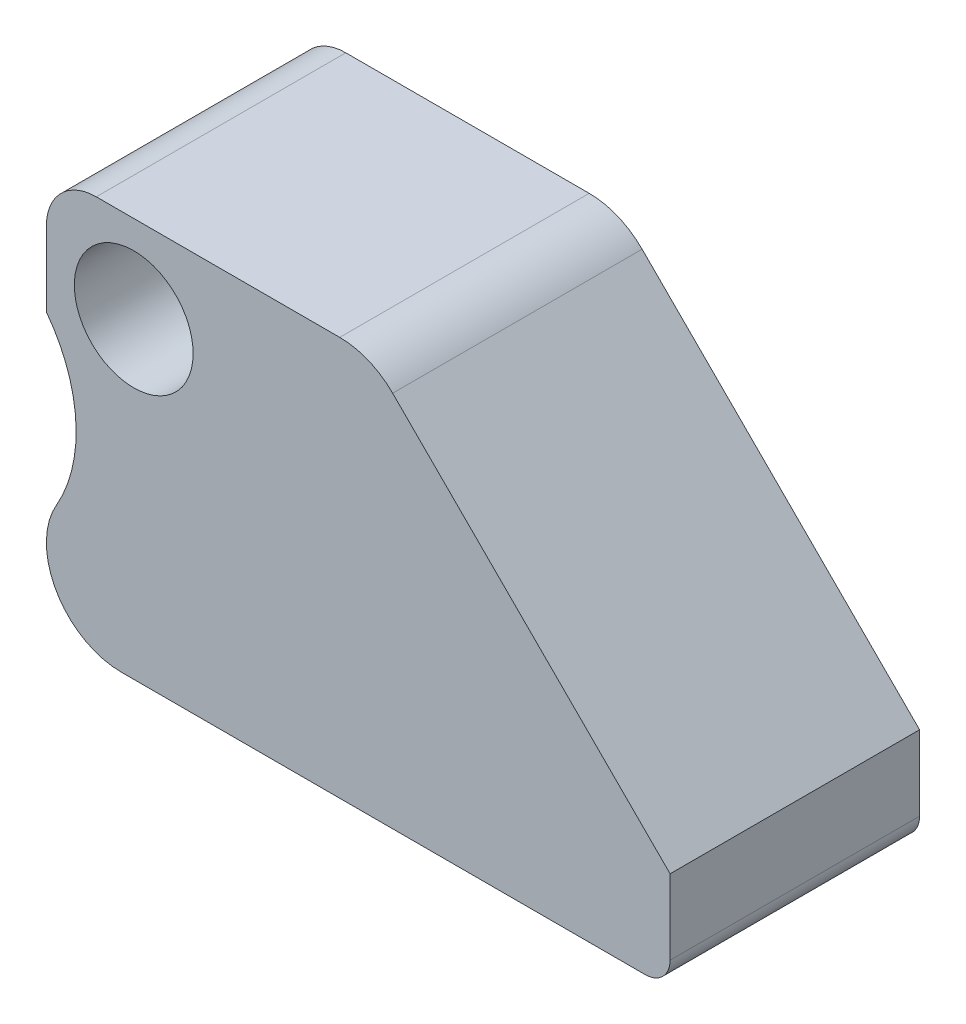
ISO-10303-21;
HEADER;
FILE_DESCRIPTION(('STEP AP214'),'2;1');
FILE_NAME('part.step','',(''),(''),'','','');
FILE_SCHEMA(('AUTOMOTIVE_DESIGN { 1 0 10303 214 1 1 1 1 }'));
ENDSEC;
DATA;
#1=APPLICATION_CONTEXT('core data for automotive mechanical design processes');
#2=APPLICATION_PROTOCOL_DEFINITION('international standard','automotive_design',2000,#1);
#3=PRODUCT_CONTEXT('',#1,'mechanical');
#4=PRODUCT('Part','Part','',(#3));
#5=PRODUCT_RELATED_PRODUCT_CATEGORY('part','',(#4));
#6=PRODUCT_DEFINITION_FORMATION('','',#4);
#7=PRODUCT_DEFINITION_CONTEXT('part definition',#1,'design');
#8=PRODUCT_DEFINITION('design','',#6,#7);
#9=PRODUCT_DEFINITION_SHAPE('','',#8);
#10=(LENGTH_UNIT() NAMED_UNIT(*) SI_UNIT(.MILLI.,.METRE.));
#11=(NAMED_UNIT(*) PLANE_ANGLE_UNIT() SI_UNIT($,.RADIAN.));
#12=(NAMED_UNIT(*) SI_UNIT($,.STERADIAN.) SOLID_ANGLE_UNIT());
#13=UNCERTAINTY_MEASURE_WITH_UNIT(LENGTH_MEASURE(1.E-05),#10,'distance_accuracy_value','');
#14=(GEOMETRIC_REPRESENTATION_CONTEXT(3) GLOBAL_UNCERTAINTY_ASSIGNED_CONTEXT((#13)) GLOBAL_UNIT_ASSIGNED_CONTEXT((#10,
#11,#12)) REPRESENTATION_CONTEXT('',''));
#15=CARTESIAN_POINT('',(0.,0.,0.));
#16=DIRECTION('',(0.,0.,1.));
#17=DIRECTION('',(1.,0.,0.));
#18=AXIS2_PLACEMENT_3D('',#15,#16,#17);
#19=CARTESIAN_POINT('',(-17.2021194919823,-0.553179237973385,10.));
#20=DIRECTION('',(0.,0.,-1.));
#21=DIRECTION('',(-1.,0.,0.));
#22=AXIS2_PLACEMENT_3D('',#19,#20,#21);
#23=CYLINDRICAL_SURFACE('',#22,5.89364152405325);
#24=CARTESIAN_POINT('',(-17.2021194919823,-0.553179237973385,0.));
#25=DIRECTION('',(0.,0.,1.));
#26=DIRECTION('',(1.,0.,0.));
#27=AXIS2_PLACEMENT_3D('',#24,#25,#26);
#28=CIRCLE('',#27,5.89364152405325);
#29=CARTESIAN_POINT('',(-12.0980762113533,-3.5,0.));
#30=VERTEX_POINT('',#29);
#31=CARTESIAN_POINT('',(-12.5,3.,0.));
#32=VERTEX_POINT('',#31);
#33=EDGE_CURVE('E118',#30,#32,#28,.T.);
#34=ORIENTED_EDGE('',*,*,#33,.F.);
#35=DIRECTION('',(0.,0.,-1.));
#36=VECTOR('',#35,1.);
#37=CARTESIAN_POINT('',(-12.0980762113533,-3.5,10.));
#38=LINE('',#37,#36);
#39=CARTESIAN_POINT('',(-12.0980762113533,-3.5,10.));
#40=VERTEX_POINT('',#39);
#41=EDGE_CURVE('E113',#40,#30,#38,.T.);
#42=ORIENTED_EDGE('',*,*,#41,.F.);
#43=CARTESIAN_POINT('',(-17.2021194919823,-0.553179237973385,10.));
#44=DIRECTION('',(0.,0.,1.));
#45=DIRECTION('',(1.,0.,0.));
#46=AXIS2_PLACEMENT_3D('',#43,#44,#45);
#47=CIRCLE('',#46,5.89364152405325);
#48=CARTESIAN_POINT('',(-12.5,3.,10.));
#49=VERTEX_POINT('',#48);
#50=EDGE_CURVE('E115',#40,#49,#47,.T.);
#51=ORIENTED_EDGE('',*,*,#50,.T.);
#52=DIRECTION('',(0.,0.,-1.));
#53=VECTOR('',#52,1.);
#54=CARTESIAN_POINT('',(-12.5,3.,10.));
#55=LINE('',#54,#53);
#56=EDGE_CURVE('E154',#49,#32,#55,.T.);
#57=ORIENTED_EDGE('',*,*,#56,.T.);
#58=EDGE_LOOP('',(#34,#42,#51,#57));
#59=FACE_BOUND('',#58,.T.);
#60=ADVANCED_FACE('F36',(#59),#23,.F.);
#61=CARTESIAN_POINT('',(-9.5,-5.,10.));
#62=DIRECTION('',(0.,0.,-1.));
#63=DIRECTION('',(-1.,0.,0.));
#64=AXIS2_PLACEMENT_3D('',#61,#62,#63);
#65=CYLINDRICAL_SURFACE('',#64,3.);
#66=CARTESIAN_POINT('',(-9.5,-5.,0.));
#67=DIRECTION('',(0.,0.,1.));
#68=DIRECTION('',(1.,0.,0.));
#69=AXIS2_PLACEMENT_3D('',#66,#67,#68);
#70=CIRCLE('',#69,3.);
#71=CARTESIAN_POINT('',(-9.5,-8.,0.));
#72=VERTEX_POINT('',#71);
#73=EDGE_CURVE('E156',#72,#30,#70,.F.);
#74=ORIENTED_EDGE('',*,*,#73,.F.);
#75=DIRECTION('',(0.,0.,-1.));
#76=VECTOR('',#75,1.);
#77=CARTESIAN_POINT('',(-9.5,-8.,10.));
#78=LINE('',#77,#76);
#79=CARTESIAN_POINT('',(-9.5,-8.,10.));
#80=VERTEX_POINT('',#79);
#81=EDGE_CURVE('E124',#80,#72,#78,.T.);
#82=ORIENTED_EDGE('',*,*,#81,.F.);
#83=CARTESIAN_POINT('',(-9.5,-5.,10.));
#84=DIRECTION('',(0.,0.,1.));
#85=DIRECTION('',(1.,0.,0.));
#86=AXIS2_PLACEMENT_3D('',#83,#84,#85);
#87=CIRCLE('',#86,3.);
#88=EDGE_CURVE('E131',#80,#40,#87,.F.);
#89=ORIENTED_EDGE('',*,*,#88,.T.);
#90=ORIENTED_EDGE('',*,*,#41,.T.);
#91=EDGE_LOOP('',(#74,#82,#89,#90));
#92=FACE_BOUND('',#91,.T.);
#93=ADVANCED_FACE('F137',(#92),#65,.T.);
#94=CARTESIAN_POINT('',(0.,-8.,10.));
#95=DIRECTION('',(0.,-1.,0.));
#96=DIRECTION('',(1.,0.,0.));
#97=AXIS2_PLACEMENT_3D('',#94,#95,#96);
#98=PLANE('',#97);
#99=DIRECTION('',(-1.,0.,0.));
#100=VECTOR('',#99,1.);
#101=CARTESIAN_POINT('',(0.,-8.,0.));
#102=LINE('',#101,#100);
#103=CARTESIAN_POINT('',(11.5,-8.,0.));
#104=VERTEX_POINT('',#103);
#105=EDGE_CURVE('E158',#104,#72,#102,.T.);
#106=ORIENTED_EDGE('',*,*,#105,.F.);
#107=DIRECTION('',(0.,0.,-1.));
#108=VECTOR('',#107,1.);
#109=CARTESIAN_POINT('',(11.5,-8.,10.));
#110=LINE('',#109,#108);
#111=CARTESIAN_POINT('',(11.5,-8.,10.));
#112=VERTEX_POINT('',#111);
#113=EDGE_CURVE('E189',#104,#112,#110,.F.);
#114=ORIENTED_EDGE('',*,*,#113,.T.);
#115=DIRECTION('',(-1.,0.,0.));
#116=VECTOR('',#115,1.);
#117=CARTESIAN_POINT('',(0.,-8.,10.));
#118=LINE('',#117,#116);
#119=EDGE_CURVE('E139',#112,#80,#118,.T.);
#120=ORIENTED_EDGE('',*,*,#119,.T.);
#121=ORIENTED_EDGE('',*,*,#81,.T.);
#122=EDGE_LOOP('',(#106,#114,#120,#121));
#123=FACE_BOUND('',#122,.T.);
#124=ADVANCED_FACE('F208',(#123),#98,.T.);
#125=CARTESIAN_POINT('',(12.5,0.,10.));
#126=DIRECTION('',(-1.,0.,0.));
#127=DIRECTION('',(0.,0.,1.));
#128=AXIS2_PLACEMENT_3D('',#125,#126,#127);
#129=PLANE('',#128);
#130=DIRECTION('',(0.,1.,0.));
#131=VECTOR('',#130,1.);
#132=CARTESIAN_POINT('',(12.5,0.,10.));
#133=LINE('',#132,#131);
#134=CARTESIAN_POINT('',(12.5,-7.,10.));
#135=VERTEX_POINT('',#134);
#136=CARTESIAN_POINT('',(12.5,-4.,10.));
#137=VERTEX_POINT('',#136);
#138=EDGE_CURVE('E141',#135,#137,#133,.T.);
#139=ORIENTED_EDGE('',*,*,#138,.F.);
#140=DIRECTION('',(0.,0.,-1.));
#141=VECTOR('',#140,1.);
#142=CARTESIAN_POINT('',(12.5,-7.,0.));
#143=LINE('',#142,#141);
#144=CARTESIAN_POINT('',(12.5,-7.,0.));
#145=VERTEX_POINT('',#144);
#146=EDGE_CURVE('E184',#135,#145,#143,.T.);
#147=ORIENTED_EDGE('',*,*,#146,.T.);
#148=DIRECTION('',(0.,1.,0.));
#149=VECTOR('',#148,1.);
#150=CARTESIAN_POINT('',(12.5,0.,0.));
#151=LINE('',#150,#149);
#152=CARTESIAN_POINT('',(12.5,-4.,0.));
#153=VERTEX_POINT('',#152);
#154=EDGE_CURVE('E160',#145,#153,#151,.T.);
#155=ORIENTED_EDGE('',*,*,#154,.T.);
#156=DIRECTION('',(0.,0.,-1.));
#157=VECTOR('',#156,1.);
#158=CARTESIAN_POINT('',(12.5,-4.,10.));
#159=LINE('',#158,#157);
#160=EDGE_CURVE('E172',#137,#153,#159,.T.);
#161=ORIENTED_EDGE('',*,*,#160,.F.);
#162=EDGE_LOOP('',(#139,#147,#155,#161));
#163=FACE_BOUND('',#162,.T.);
#164=ADVANCED_FACE('F215',(#163),#129,.F.);
#165=CARTESIAN_POINT('',(4.25,4.25,10.));
#166=DIRECTION('',(0.707106781186548,0.707106781186548,0.));
#167=DIRECTION('',(-0.707106781186548,0.707106781186548,0.));
#168=AXIS2_PLACEMENT_3D('',#165,#166,#167);
#169=PLANE('',#168);
#170=DIRECTION('',(0.707106781186548,-0.707106781186548,0.));
#171=VECTOR('',#170,1.);
#172=CARTESIAN_POINT('',(4.25,4.25,0.));
#173=LINE('',#172,#171);
#174=CARTESIAN_POINT('',(1.37867965644035,7.12132034355964,0.));
#175=VERTEX_POINT('',#174);
#176=EDGE_CURVE('E162',#175,#153,#173,.T.);
#177=ORIENTED_EDGE('',*,*,#176,.F.);
#178=DIRECTION('',(0.,0.,-1.));
#179=VECTOR('',#178,1.);
#180=CARTESIAN_POINT('',(1.37867965644035,7.12132034355964,10.));
#181=LINE('',#180,#179);
#182=CARTESIAN_POINT('',(1.37867965644035,7.12132034355964,10.));
#183=VERTEX_POINT('',#182);
#184=EDGE_CURVE('E180',#175,#183,#181,.F.);
#185=ORIENTED_EDGE('',*,*,#184,.T.);
#186=DIRECTION('',(0.707106781186548,-0.707106781186548,0.));
#187=VECTOR('',#186,1.);
#188=CARTESIAN_POINT('',(4.25,4.25,10.));
#189=LINE('',#188,#187);
#190=EDGE_CURVE('E145',#183,#137,#189,.T.);
#191=ORIENTED_EDGE('',*,*,#190,.T.);
#192=ORIENTED_EDGE('',*,*,#160,.T.);
#193=EDGE_LOOP('',(#177,#185,#191,#192));
#194=FACE_BOUND('',#193,.T.);
#195=ADVANCED_FACE('F220',(#194),#169,.T.);
#196=CARTESIAN_POINT('',(0.,8.,10.));
#197=DIRECTION('',(0.,-1.,0.));
#198=DIRECTION('',(1.,0.,0.));
#199=AXIS2_PLACEMENT_3D('',#196,#197,#198);
#200=PLANE('',#199);
#201=DIRECTION('',(-1.,0.,0.));
#202=VECTOR('',#201,1.);
#203=CARTESIAN_POINT('',(0.,8.,0.));
#204=LINE('',#203,#202);
#205=CARTESIAN_POINT('',(-0.742640687119289,8.,0.));
#206=VERTEX_POINT('',#205);
#207=CARTESIAN_POINT('',(-10.5,8.,0.));
#208=VERTEX_POINT('',#207);
#209=EDGE_CURVE('E165',#206,#208,#204,.T.);
#210=ORIENTED_EDGE('',*,*,#209,.T.);
#211=DIRECTION('',(0.,0.,-1.));
#212=VECTOR('',#211,1.);
#213=CARTESIAN_POINT('',(-10.5,8.,10.));
#214=LINE('',#213,#212);
#215=CARTESIAN_POINT('',(-10.5,8.,10.));
#216=VERTEX_POINT('',#215);
#217=EDGE_CURVE('E44',#208,#216,#214,.F.);
#218=ORIENTED_EDGE('',*,*,#217,.T.);
#219=DIRECTION('',(-1.,0.,0.));
#220=VECTOR('',#219,1.);
#221=CARTESIAN_POINT('',(0.,8.,10.));
#222=LINE('',#221,#220);
#223=CARTESIAN_POINT('',(-0.742640687119289,8.,10.));
#224=VERTEX_POINT('',#223);
#225=EDGE_CURVE('E148',#224,#216,#222,.T.);
#226=ORIENTED_EDGE('',*,*,#225,.F.);
#227=DIRECTION('',(0.,0.,-1.));
#228=VECTOR('',#227,1.);
#229=CARTESIAN_POINT('',(-0.742640687119289,8.,0.));
#230=LINE('',#229,#228);
#231=EDGE_CURVE('E123',#224,#206,#230,.T.);
#232=ORIENTED_EDGE('',*,*,#231,.T.);
#233=EDGE_LOOP('',(#210,#218,#226,#232));
#234=FACE_BOUND('',#233,.T.);
#235=ADVANCED_FACE('F226',(#234),#200,.F.);
#236=CARTESIAN_POINT('',(-12.5,0.,10.));
#237=DIRECTION('',(-1.,0.,0.));
#238=DIRECTION('',(0.,0.,1.));
#239=AXIS2_PLACEMENT_3D('',#236,#237,#238);
#240=PLANE('',#239);
#241=DIRECTION('',(0.,1.,0.));
#242=VECTOR('',#241,1.);
#243=CARTESIAN_POINT('',(-12.5,0.,10.));
#244=LINE('',#243,#242);
#245=CARTESIAN_POINT('',(-12.5,6.,10.));
#246=VERTEX_POINT('',#245);
#247=EDGE_CURVE('E133',#49,#246,#244,.T.);
#248=ORIENTED_EDGE('',*,*,#247,.T.);
#249=DIRECTION('',(0.,0.,-1.));
#250=VECTOR('',#249,1.);
#251=CARTESIAN_POINT('',(-12.5,6.,0.));
#252=LINE('',#251,#250);
#253=CARTESIAN_POINT('',(-12.5,6.,0.));
#254=VERTEX_POINT('',#253);
#255=EDGE_CURVE('E193',#246,#254,#252,.T.);
#256=ORIENTED_EDGE('',*,*,#255,.T.);
#257=DIRECTION('',(0.,1.,0.));
#258=VECTOR('',#257,1.);
#259=CARTESIAN_POINT('',(-12.5,0.,0.));
#260=LINE('',#259,#258);
#261=EDGE_CURVE('E167',#32,#254,#260,.T.);
#262=ORIENTED_EDGE('',*,*,#261,.F.);
#263=ORIENTED_EDGE('',*,*,#56,.F.);
#264=EDGE_LOOP('',(#248,#256,#262,#263));
#265=FACE_BOUND('',#264,.T.);
#266=ADVANCED_FACE('F199',(#265),#240,.T.);
#267=CARTESIAN_POINT('',(-9.,4.5,10.));
#268=DIRECTION('',(0.,0.,-1.));
#269=DIRECTION('',(-1.,0.,0.));
#270=AXIS2_PLACEMENT_3D('',#267,#268,#269);
#271=CYLINDRICAL_SURFACE('',#270,2.38125);
#272=CARTESIAN_POINT('',(-9.,4.5,10.));
#273=DIRECTION('',(0.,0.,1.));
#274=DIRECTION('',(1.,0.,0.));
#275=AXIS2_PLACEMENT_3D('',#272,#273,#274);
#276=CIRCLE('',#275,2.38125);
#277=CARTESIAN_POINT('',(-6.61875,4.5,10.));
#278=VERTEX_POINT('',#277);
#279=EDGE_CURVE('E151',#278,#278,#276,.T.);
#280=ORIENTED_EDGE('',*,*,#279,.T.);
#281=EDGE_LOOP('',(#280));
#282=FACE_BOUND('',#281,.T.);
#283=CARTESIAN_POINT('',(-9.,4.5,0.));
#284=DIRECTION('',(0.,0.,1.));
#285=DIRECTION('',(1.,0.,0.));
#286=AXIS2_PLACEMENT_3D('',#283,#284,#285);
#287=CIRCLE('',#286,2.38125);
#288=CARTESIAN_POINT('',(-6.61875,4.5,0.));
#289=VERTEX_POINT('',#288);
#290=EDGE_CURVE('E134',#289,#289,#287,.T.);
#291=ORIENTED_EDGE('',*,*,#290,.F.);
#292=EDGE_LOOP('',(#291));
#293=FACE_BOUND('',#292,.T.);
#294=ADVANCED_FACE('F247',(#282,#293),#271,.F.);
#295=CARTESIAN_POINT('',(0.,0.,10.));
#296=DIRECTION('',(0.,0.,1.));
#297=DIRECTION('',(1.,0.,0.));
#298=AXIS2_PLACEMENT_3D('',#295,#296,#297);
#299=PLANE('',#298);
#300=ORIENTED_EDGE('',*,*,#225,.T.);
#301=CARTESIAN_POINT('',(-10.5,6.,10.));
#302=DIRECTION('',(0.,0.,1.));
#303=DIRECTION('',(1.,0.,0.));
#304=AXIS2_PLACEMENT_3D('',#301,#302,#303);
#305=CIRCLE('',#304,2.);
#306=EDGE_CURVE('E11',#216,#246,#305,.T.);
#307=ORIENTED_EDGE('',*,*,#306,.T.);
#308=ORIENTED_EDGE('',*,*,#247,.F.);
#309=ORIENTED_EDGE('',*,*,#50,.F.);
#310=ORIENTED_EDGE('',*,*,#88,.F.);
#311=ORIENTED_EDGE('',*,*,#119,.F.);
#312=CARTESIAN_POINT('',(11.5,-7.,10.));
#313=DIRECTION('',(0.,0.,1.));
#314=DIRECTION('',(1.,0.,0.));
#315=AXIS2_PLACEMENT_3D('',#312,#313,#314);
#316=CIRCLE('',#315,1.);
#317=EDGE_CURVE('E191',#112,#135,#316,.T.);
#318=ORIENTED_EDGE('',*,*,#317,.T.);
#319=ORIENTED_EDGE('',*,*,#138,.T.);
#320=ORIENTED_EDGE('',*,*,#190,.F.);
#321=CARTESIAN_POINT('',(-0.742640687119289,5.,10.));
#322=DIRECTION('',(0.,0.,1.));
#323=DIRECTION('',(1.,0.,0.));
#324=AXIS2_PLACEMENT_3D('',#321,#322,#323);
#325=CIRCLE('',#324,3.);
#326=EDGE_CURVE('E182',#183,#224,#325,.T.);
#327=ORIENTED_EDGE('',*,*,#326,.T.);
#328=EDGE_LOOP('',(#300,#307,#308,#309,#310,#311,#318,#319,#320,#327));
#329=FACE_BOUND('',#328,.T.);
#330=ORIENTED_EDGE('',*,*,#279,.F.);
#331=EDGE_LOOP('',(#330));
#332=FACE_BOUND('',#331,.T.);
#333=ADVANCED_FACE('F128',(#329,#332),#299,.T.);
#334=CARTESIAN_POINT('',(0.,0.,0.));
#335=DIRECTION('',(0.,0.,1.));
#336=DIRECTION('',(1.,0.,0.));
#337=AXIS2_PLACEMENT_3D('',#334,#335,#336);
#338=PLANE('',#337);
#339=ORIENTED_EDGE('',*,*,#261,.T.);
#340=CARTESIAN_POINT('',(-10.5,6.,0.));
#341=DIRECTION('',(0.,0.,1.));
#342=DIRECTION('',(1.,0.,0.));
#343=AXIS2_PLACEMENT_3D('',#340,#341,#342);
#344=CIRCLE('',#343,2.);
#345=EDGE_CURVE('E58',#254,#208,#344,.F.);
#346=ORIENTED_EDGE('',*,*,#345,.T.);
#347=ORIENTED_EDGE('',*,*,#209,.F.);
#348=CARTESIAN_POINT('',(-0.742640687119289,5.,0.));
#349=DIRECTION('',(0.,0.,1.));
#350=DIRECTION('',(1.,0.,0.));
#351=AXIS2_PLACEMENT_3D('',#348,#349,#350);
#352=CIRCLE('',#351,3.);
#353=EDGE_CURVE('E178',#206,#175,#352,.F.);
#354=ORIENTED_EDGE('',*,*,#353,.T.);
#355=ORIENTED_EDGE('',*,*,#176,.T.);
#356=ORIENTED_EDGE('',*,*,#154,.F.);
#357=CARTESIAN_POINT('',(11.5,-7.,0.));
#358=DIRECTION('',(0.,0.,1.));
#359=DIRECTION('',(1.,0.,0.));
#360=AXIS2_PLACEMENT_3D('',#357,#358,#359);
#361=CIRCLE('',#360,1.);
#362=EDGE_CURVE('E187',#145,#104,#361,.F.);
#363=ORIENTED_EDGE('',*,*,#362,.T.);
#364=ORIENTED_EDGE('',*,*,#105,.T.);
#365=ORIENTED_EDGE('',*,*,#73,.T.);
#366=ORIENTED_EDGE('',*,*,#33,.T.);
#367=EDGE_LOOP('',(#339,#346,#347,#354,#355,#356,#363,#364,#365,#366));
#368=FACE_BOUND('',#367,.T.);
#369=ORIENTED_EDGE('',*,*,#290,.T.);
#370=EDGE_LOOP('',(#369));
#371=FACE_BOUND('',#370,.T.);
#372=ADVANCED_FACE('F202',(#368,#371),#338,.F.);
#373=CARTESIAN_POINT('',(-0.742640687119289,5.,10.));
#374=DIRECTION('',(0.,0.,1.));
#375=DIRECTION('',(1.,0.,0.));
#376=AXIS2_PLACEMENT_3D('',#373,#374,#375);
#377=CYLINDRICAL_SURFACE('',#376,3.);
#378=ORIENTED_EDGE('',*,*,#326,.F.);
#379=ORIENTED_EDGE('',*,*,#184,.F.);
#380=ORIENTED_EDGE('',*,*,#353,.F.);
#381=ORIENTED_EDGE('',*,*,#231,.F.);
#382=EDGE_LOOP('',(#378,#379,#380,#381));
#383=FACE_BOUND('',#382,.T.);
#384=ADVANCED_FACE('F225',(#383),#377,.T.);
#385=CARTESIAN_POINT('',(11.5,-7.,10.));
#386=DIRECTION('',(0.,0.,1.));
#387=DIRECTION('',(1.,0.,0.));
#388=AXIS2_PLACEMENT_3D('',#385,#386,#387);
#389=CYLINDRICAL_SURFACE('',#388,1.);
#390=ORIENTED_EDGE('',*,*,#317,.F.);
#391=ORIENTED_EDGE('',*,*,#113,.F.);
#392=ORIENTED_EDGE('',*,*,#362,.F.);
#393=ORIENTED_EDGE('',*,*,#146,.F.);
#394=EDGE_LOOP('',(#390,#391,#392,#393));
#395=FACE_BOUND('',#394,.T.);
#396=ADVANCED_FACE('F213',(#395),#389,.T.);
#397=CARTESIAN_POINT('',(-10.5,6.,10.));
#398=DIRECTION('',(0.,0.,1.));
#399=DIRECTION('',(1.,0.,0.));
#400=AXIS2_PLACEMENT_3D('',#397,#398,#399);
#401=CYLINDRICAL_SURFACE('',#400,2.);
#402=ORIENTED_EDGE('',*,*,#306,.F.);
#403=ORIENTED_EDGE('',*,*,#217,.F.);
#404=ORIENTED_EDGE('',*,*,#345,.F.);
#405=ORIENTED_EDGE('',*,*,#255,.F.);
#406=EDGE_LOOP('',(#402,#403,#404,#405));
#407=FACE_BOUND('',#406,.T.);
#408=ADVANCED_FACE('F38',(#407),#401,.T.);
#409=CLOSED_SHELL('',(#60,#93,#124,#164,#195,#235,#266,#294,#333,#372,#384,#396,#408));
#410=MANIFOLD_SOLID_BREP('B2',#409);
#411=ADVANCED_BREP_SHAPE_REPRESENTATION('',(#18,#410),#14);
#412=SHAPE_DEFINITION_REPRESENTATION(#9,#411);
ENDSEC;
END-ISO-10303-21;
